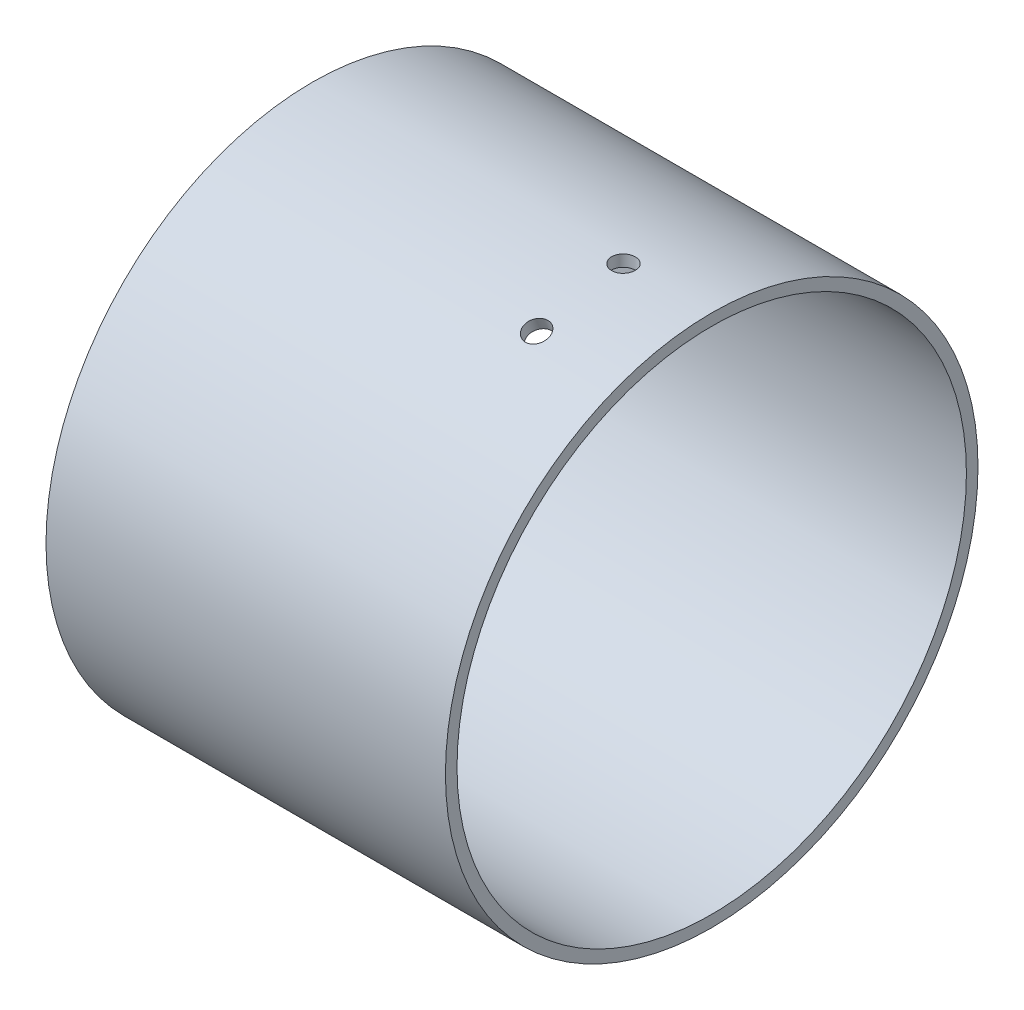
ISO-10303-21;
HEADER;
FILE_DESCRIPTION(('STEP AP214'),'2;1');
FILE_NAME('part.step','',(''),(''),'','','');
FILE_SCHEMA(('AUTOMOTIVE_DESIGN { 1 0 10303 214 1 1 1 1 }'));
ENDSEC;
DATA;
#1=APPLICATION_CONTEXT('core data for automotive mechanical design processes');
#2=APPLICATION_PROTOCOL_DEFINITION('international standard','automotive_design',2000,#1);
#3=PRODUCT_CONTEXT('',#1,'mechanical');
#4=PRODUCT('Part','Part','',(#3));
#5=PRODUCT_RELATED_PRODUCT_CATEGORY('part','',(#4));
#6=PRODUCT_DEFINITION_FORMATION('','',#4);
#7=PRODUCT_DEFINITION_CONTEXT('part definition',#1,'design');
#8=PRODUCT_DEFINITION('design','',#6,#7);
#9=PRODUCT_DEFINITION_SHAPE('','',#8);
#10=(LENGTH_UNIT() NAMED_UNIT(*) SI_UNIT(.MILLI.,.METRE.));
#11=(NAMED_UNIT(*) PLANE_ANGLE_UNIT() SI_UNIT($,.RADIAN.));
#12=(NAMED_UNIT(*) SI_UNIT($,.STERADIAN.) SOLID_ANGLE_UNIT());
#13=UNCERTAINTY_MEASURE_WITH_UNIT(LENGTH_MEASURE(1.E-05),#10,'distance_accuracy_value','');
#14=(GEOMETRIC_REPRESENTATION_CONTEXT(3) GLOBAL_UNCERTAINTY_ASSIGNED_CONTEXT((#13)) GLOBAL_UNIT_ASSIGNED_CONTEXT((#10,
#11,#12)) REPRESENTATION_CONTEXT('',''));
#15=CARTESIAN_POINT('',(0.,0.,0.));
#16=DIRECTION('',(0.,0.,1.));
#17=DIRECTION('',(1.,0.,0.));
#18=AXIS2_PLACEMENT_3D('',#15,#16,#17);
#19=CARTESIAN_POINT('',(69.,0.,0.));
#20=DIRECTION('',(1.,0.,0.));
#21=DIRECTION('',(0.,0.,-1.));
#22=AXIS2_PLACEMENT_3D('',#19,#20,#21);
#23=PLANE('',#22);
#24=CARTESIAN_POINT('',(69.,0.,0.));
#25=DIRECTION('',(1.,0.,0.));
#26=DIRECTION('',(0.,0.,-1.));
#27=AXIS2_PLACEMENT_3D('',#24,#25,#26);
#28=CIRCLE('',#27,46.);
#29=CARTESIAN_POINT('',(69.,0.,-46.));
#30=VERTEX_POINT('',#29);
#31=EDGE_CURVE('E10',#30,#30,#28,.T.);
#32=ORIENTED_EDGE('',*,*,#31,.T.);
#33=EDGE_LOOP('',(#32));
#34=FACE_BOUND('',#33,.T.);
#35=CARTESIAN_POINT('',(69.,0.,0.));
#36=DIRECTION('',(1.,0.,0.));
#37=DIRECTION('',(0.,0.,-1.));
#38=AXIS2_PLACEMENT_3D('',#35,#36,#37);
#39=CIRCLE('',#38,44.);
#40=CARTESIAN_POINT('',(69.,0.,-44.));
#41=VERTEX_POINT('',#40);
#42=EDGE_CURVE('E43',#41,#41,#39,.T.);
#43=ORIENTED_EDGE('',*,*,#42,.F.);
#44=EDGE_LOOP('',(#43));
#45=FACE_BOUND('',#44,.T.);
#46=ADVANCED_FACE('F31',(#34,#45),#23,.T.);
#47=CARTESIAN_POINT('',(0.,0.,0.));
#48=DIRECTION('',(1.,0.,0.));
#49=DIRECTION('',(0.,0.,-1.));
#50=AXIS2_PLACEMENT_3D('',#47,#48,#49);
#51=PLANE('',#50);
#52=CARTESIAN_POINT('',(0.,0.,0.));
#53=DIRECTION('',(1.,0.,0.));
#54=DIRECTION('',(0.,0.,-1.));
#55=AXIS2_PLACEMENT_3D('',#52,#53,#54);
#56=CIRCLE('',#55,46.);
#57=CARTESIAN_POINT('',(0.,0.,-46.));
#58=VERTEX_POINT('',#57);
#59=EDGE_CURVE('E36',#58,#58,#56,.T.);
#60=ORIENTED_EDGE('',*,*,#59,.F.);
#61=EDGE_LOOP('',(#60));
#62=FACE_BOUND('',#61,.T.);
#63=CARTESIAN_POINT('',(0.,0.,0.));
#64=DIRECTION('',(1.,0.,0.));
#65=DIRECTION('',(0.,0.,-1.));
#66=AXIS2_PLACEMENT_3D('',#63,#64,#65);
#67=CIRCLE('',#66,44.);
#68=CARTESIAN_POINT('',(0.,0.,-44.));
#69=VERTEX_POINT('',#68);
#70=EDGE_CURVE('E45',#69,#69,#67,.T.);
#71=ORIENTED_EDGE('',*,*,#70,.T.);
#72=EDGE_LOOP('',(#71));
#73=FACE_BOUND('',#72,.T.);
#74=ADVANCED_FACE('F77',(#62,#73),#51,.F.);
#75=CARTESIAN_POINT('',(69.,0.,0.));
#76=DIRECTION('',(-1.,0.,0.));
#77=DIRECTION('',(0.,0.,1.));
#78=AXIS2_PLACEMENT_3D('',#75,#76,#77);
#79=CYLINDRICAL_SURFACE('',#78,46.);
#80=CARTESIAN_POINT('',(54.,45.9434053143207,2.28111992758998));
#81=CARTESIAN_POINT('',(53.8852091887696,45.9434059520648,2.28111485929366));
#82=CARTESIAN_POINT('',(53.7703365874878,45.943889942447,2.27142318395973));
#83=CARTESIAN_POINT('',(53.5437592134882,45.9457780972293,2.23289781368698));
#84=CARTESIAN_POINT('',(53.4320583535027,45.9471833507011,2.20404146268955));
#85=CARTESIAN_POINT('',(53.2151395212184,45.9507671369807,2.1280130350752));
#86=CARTESIAN_POINT('',(53.1099183185955,45.9529452807542,2.08085017192561));
#87=CARTESIAN_POINT('',(52.9089169142848,45.9578493700051,1.96956050785337));
#88=CARTESIAN_POINT('',(52.8131344666421,45.9605751846927,1.90543775598548));
#89=CARTESIAN_POINT('',(52.633621145223,45.9662978774121,1.76198763577333));
#90=CARTESIAN_POINT('',(52.5498990226666,45.969294949732,1.68264932305556));
#91=CARTESIAN_POINT('',(52.3969573398346,45.9752554360335,1.51104045068999));
#92=CARTESIAN_POINT('',(52.3277383667706,45.9782188486476,1.41876936766533));
#93=CARTESIAN_POINT('',(52.2057457169492,45.9838192877889,1.22386980229755));
#94=CARTESIAN_POINT('',(52.1529785604573,45.9864561846607,1.12123723471799));
#95=CARTESIAN_POINT('',(52.0654293442119,45.9911494570148,0.908555963408038));
#96=CARTESIAN_POINT('',(52.0306471693399,45.9932058362128,0.798507307151797));
#97=CARTESIAN_POINT('',(51.9800775584406,45.9965527713279,0.574194896922338));
#98=CARTESIAN_POINT('',(51.9642774645714,45.9978438372882,0.459934004259349));
#99=CARTESIAN_POINT('',(51.952081472976,45.9995663056323,0.23037534331828));
#100=CARTESIAN_POINT('',(51.9556854471969,45.9999977136893,0.115077581887805));
#101=CARTESIAN_POINT('',(51.9821847480803,46.0000022670781,-0.113196156602176));
#102=CARTESIAN_POINT('',(52.0050664436614,45.9995760185546,-0.226173716445867));
#103=CARTESIAN_POINT('',(52.0694505402093,45.9979634007833,-0.446686439155511));
#104=CARTESIAN_POINT('',(52.1109530071589,45.996777028842,-0.554221582734702));
#105=CARTESIAN_POINT('',(52.2114161213941,45.9938236472781,-0.760840110468499));
#106=CARTESIAN_POINT('',(52.2703829914636,45.9920564306686,-0.859920465840257));
#107=CARTESIAN_POINT('',(52.4040964993486,45.9881832015296,-1.04678276490501));
#108=CARTESIAN_POINT('',(52.478843223919,45.9860771871375,-1.13456464647669));
#109=CARTESIAN_POINT('',(52.6420717444146,45.9817994346659,-1.29641657706345));
#110=CARTESIAN_POINT('',(52.7305653655903,45.9796276413097,-1.37047469931516));
#111=CARTESIAN_POINT('',(52.9187340793171,45.9754970646412,-1.50268389816145));
#112=CARTESIAN_POINT('',(53.0184091744044,45.9735382813773,-1.56083497114775));
#113=CARTESIAN_POINT('',(53.2261184714863,45.9700800124716,-1.65957727507637));
#114=CARTESIAN_POINT('',(53.3341528773368,45.9685805380353,-1.70016807762237));
#115=CARTESIAN_POINT('',(53.555510918732,45.9662280841509,-1.76262900294206));
#116=CARTESIAN_POINT('',(53.6688345228204,45.9653751008585,-1.78449923703674));
#117=CARTESIAN_POINT('',(53.8974502680274,45.9644220465223,-1.80888307436124));
#118=CARTESIAN_POINT('',(54.0127406416385,45.964321331818,-1.81141322551292));
#119=CARTESIAN_POINT('',(54.2421085230635,45.9648835899868,-1.79708818999605));
#120=CARTESIAN_POINT('',(54.3561860340326,45.9655465608727,-1.78023305376959));
#121=CARTESIAN_POINT('',(54.5798435813833,45.9675535565866,-1.72762994229583));
#122=CARTESIAN_POINT('',(54.6894253977242,45.9688973090073,-1.69188952354182));
#123=CARTESIAN_POINT('',(54.9010357104069,45.9720986759716,-1.602538698015));
#124=CARTESIAN_POINT('',(55.0030641723412,45.9739562928557,-1.54892820984505));
#125=CARTESIAN_POINT('',(55.196747712728,45.9779543059823,-1.42531744331151));
#126=CARTESIAN_POINT('',(55.2883956874016,45.9800948937278,-1.35530604048875));
#127=CARTESIAN_POINT('',(55.4586452810879,45.9843864020971,-1.20089817678065));
#128=CARTESIAN_POINT('',(55.5372468331449,45.9865373227739,-1.11650164207379));
#129=CARTESIAN_POINT('',(55.6792278509785,45.9905722009934,-0.935649335577869));
#130=CARTESIAN_POINT('',(55.7425966367788,45.9924559708543,-0.839185174579908));
#131=CARTESIAN_POINT('',(55.8522403169389,45.9957005388652,-0.636979432755378));
#132=CARTESIAN_POINT('',(55.8985152740052,45.9970613389336,-0.531237885963498));
#133=CARTESIAN_POINT('',(55.9726390161939,45.9990602347191,-0.313519721074557));
#134=CARTESIAN_POINT('',(56.0004946614284,45.9996985995641,-0.201545441169629));
#135=CARTESIAN_POINT('',(56.0370115335636,46.0001329501857,0.0254919883610458));
#136=CARTESIAN_POINT('',(56.0456728387694,45.9999289393989,0.140555125383565));
#137=CARTESIAN_POINT('',(56.043554379975,45.9986521757424,0.370397719483432));
#138=CARTESIAN_POINT('',(56.0327913862475,45.9975801727079,0.485177335677087));
#139=CARTESIAN_POINT('',(55.9921644732912,45.9946393663857,0.711294256872851));
#140=CARTESIAN_POINT('',(55.9623005173775,45.9927705615676,0.822631555263288));
#141=CARTESIAN_POINT('',(55.8843226363764,45.9883982452635,1.03870799717364));
#142=CARTESIAN_POINT('',(55.8362085060822,45.9858947266409,1.14344706648696));
#143=CARTESIAN_POINT('',(55.7230994038996,45.9804893388021,1.34335850162151));
#144=CARTESIAN_POINT('',(55.6581049803395,45.9775874825266,1.43853117805188));
#145=CARTESIAN_POINT('',(55.5130217706352,45.971668148861,1.61669203172198));
#146=CARTESIAN_POINT('',(55.4329216242711,45.9686505858235,1.6996709545718));
#147=CARTESIAN_POINT('',(55.2599019734872,45.962805006431,1.85102935651136));
#148=CARTESIAN_POINT('',(55.1669793133893,45.9599770369913,1.9194052311395));
#149=CARTESIAN_POINT('',(54.9708913989624,45.9547983652499,2.03964298517857));
#150=CARTESIAN_POINT('',(54.8677174372294,45.9524480739355,2.09149066559217));
#151=CARTESIAN_POINT('',(54.6541958594725,45.9484735357265,2.17706967270035));
#152=CARTESIAN_POINT('',(54.5438569182605,45.9468484289386,2.21082246517511));
#153=CARTESIAN_POINT('',(54.3606905230218,45.9449240821097,2.25037077027));
#154=CARTESIAN_POINT('',(54.2890503221836,45.9443568586466,2.26188706070603));
#155=CARTESIAN_POINT('',(54.1449509533619,45.9435972735056,2.2772632371562));
#156=CARTESIAN_POINT('',(54.0724917859251,45.9434049115776,2.28112312828042));
#157=CARTESIAN_POINT('',(54.,45.9434053143207,2.28111992758998));
#158=B_SPLINE_CURVE_WITH_KNOTS('',3,(#80,#81,#82,#83,#84,#85,#86,#87,#88,#89,#90,#91,#92,#93,
#94,#95,#96,#97,#98,#99,#100,#101,#102,#103,#104,#105,#106,#107,#108,#109,#110,#111,#112,#113,
#114,#115,#116,#117,#118,#119,#120,#121,#122,#123,#124,#125,#126,#127,#128,#129,#130,#131,#132,
#133,#134,#135,#136,#137,#138,#139,#140,#141,#142,#143,#144,#145,#146,#147,#148,#149,#150,#151,
#152,#153,#154,#155,#156,#157),.UNSPECIFIED.,.T.,.F.,(4,2,2,2,2,2,2,2,2,2,2,2,2,2,2,2,2,2,2,2,2,
2,2,2,2,2,2,2,2,2,2,2,2,2,2,2,2,2,4),(0.,0.344107816898277,0.688623156328655,1.03296532931029,
1.37722536709815,1.72173396214997,2.06625650316298,2.41091541399544,2.75557211870121,
3.09999886780337,3.4444233439384,3.78860448521623,4.13278684611308,4.47709199130739,
4.82139902948113,5.16600390187606,5.51060885243955,5.85522220943235,6.19983351718367,
6.54414993271413,6.88846545230764,7.23264330650477,7.57682272843369,7.92123628077925,
8.26565160063745,8.61030769675449,8.95496252853128,9.29948892421056,9.64401391435864,
9.98824159574565,10.3324699382508,10.6767021514085,11.0209231841524,11.3654041272922,
11.7099700004368,12.0548310895635,12.3992821631242,12.6165905572309,12.8338988063004),.UNSPECIFIED.);
#159=CARTESIAN_POINT('',(54.,45.9434053143207,2.28111992758998));
#160=VERTEX_POINT('',#159);
#161=EDGE_CURVE('E94',#160,#160,#158,.T.);
#162=ORIENTED_EDGE('',*,*,#161,.T.);
#163=EDGE_LOOP('',(#162));
#164=FACE_BOUND('',#163,.T.);
#165=CARTESIAN_POINT('',(54.,42.6766684131246,17.1668859481333));
#166=CARTESIAN_POINT('',(53.8852091887696,42.6766706718183,17.1668813663599));
#167=CARTESIAN_POINT('',(53.7703365874878,42.6802946334221,17.1578797154134));
#168=CARTESIAN_POINT('',(53.5437592134882,42.6946664473815,17.1220855783705));
#169=CARTESIAN_POINT('',(53.4320583535027,42.7054227313881,17.0952720354383));
#170=CARTESIAN_POINT('',(53.2151395212184,42.7336503845806,17.024587065856));
#171=CARTESIAN_POINT('',(53.1099183185955,42.7511183757931,16.9807242199181));
#172=CARTESIAN_POINT('',(52.9089169142848,42.7921146745085,16.8771445746574));
#173=CARTESIAN_POINT('',(52.8131344666421,42.8156415354634,16.8174315594394));
#174=CARTESIAN_POINT('',(52.633621145223,42.8679192050683,16.6837239251715));
#175=CARTESIAN_POINT('',(52.5498990226666,42.8966737731673,16.6097190258686));
#176=CARTESIAN_POINT('',(52.3969573398346,42.9583764141225,16.4494757215757));
#177=CARTESIAN_POINT('',(52.3277383667706,42.9913246566878,16.3632368214858));
#178=CARTESIAN_POINT('',(52.2057457169492,43.06029671154,16.1808634101875));
#179=CARTESIAN_POINT('',(52.1529785604573,43.0963217360447,16.0847249955837));
#180=CARTESIAN_POINT('',(52.0654293442119,43.1702461762814,15.8852493652248));
#181=CARTESIAN_POINT('',(52.0306471693399,43.2081455800141,15.7819121955523));
#182=CARTESIAN_POINT('',(51.9800775584406,43.2845977803308,15.5710038732311));
#183=CARTESIAN_POINT('',(51.9642774645714,43.3231501240987,15.4634355915052));
#184=CARTESIAN_POINT('',(51.952081472976,43.3997811028907,15.2470381820946));
#185=CARTESIAN_POINT('',(51.9556854471969,43.4378597410392,15.1382090627352));
#186=CARTESIAN_POINT('',(51.9821847480803,43.5124472672362,14.9224647681623));
#187=CARTESIAN_POINT('',(52.0050664436614,43.5489572453019,14.8155482950738));
#188=CARTESIAN_POINT('',(52.0694505402093,43.6194806183838,14.6066107080722));
#189=CARTESIAN_POINT('',(52.1109530071589,43.6534940045529,14.5045896115074));
#190=CARTESIAN_POINT('',(52.2114161213941,43.7182105862787,14.3083456242995));
#191=CARTESIAN_POINT('',(52.2703829914636,43.7489125966227,14.2141255285875));
#192=CARTESIAN_POINT('',(52.4040964993486,43.8063049173611,14.0362529836684));
#193=CARTESIAN_POINT('',(52.478843223919,43.8329952056982,13.9526005925647));
#194=CARTESIAN_POINT('',(52.6420717444146,43.8818336380311,13.7982336462059));
#195=CARTESIAN_POINT('',(52.7305653655903,43.9039778329865,13.7275303450976));
#196=CARTESIAN_POINT('',(52.9187340793171,43.9432702793528,13.6012273855846));
#197=CARTESIAN_POINT('',(53.0184091744044,43.9604185296303,13.5456277306059));
#198=CARTESIAN_POINT('',(53.2261184714863,43.9894118442252,13.4511746209813));
#199=CARTESIAN_POINT('',(53.3341528773368,44.0012567791644,13.4123215748819));
#200=CARTESIAN_POINT('',(53.555510918732,44.019441109641,13.3525199749352));
#201=CARTESIAN_POINT('',(53.6688345228204,44.0257805379166,13.3315713146203));
#202=CARTESIAN_POINT('',(53.8974502680274,44.0328466495373,13.3082143049272));
#203=CARTESIAN_POINT('',(54.0127406416385,44.0335781312016,13.3057901054972));
#204=CARTESIAN_POINT('',(54.2421085230635,44.0294291542234,13.3195126696468));
#205=CARTESIAN_POINT('',(54.3561860340326,44.0245487101835,13.3356593849036));
#206=CARTESIAN_POINT('',(54.5798435813833,44.0092586959194,13.3860313099444));
#207=CARTESIAN_POINT('',(54.6894253977242,43.9988513371494,13.4202492889425));
#208=CARTESIAN_POINT('',(54.9010357104069,43.9726836704766,13.505742399739));
#209=CARTESIAN_POINT('',(55.0030641723412,43.9569233381913,13.5570176092322));
#210=CARTESIAN_POINT('',(55.196747712728,43.9203149446255,13.6751507173454));
#211=CARTESIAN_POINT('',(55.2883956874017,43.8994634296753,13.7420191924693));
#212=CARTESIAN_POINT('',(55.4586452810879,43.8530701768819,13.8893551063336));
#213=CARTESIAN_POINT('',(55.5372468331449,43.8275284149693,13.9698226148614));
#214=CARTESIAN_POINT('',(55.6792278509785,43.7722524994062,14.142067818469));
#215=CARTESIAN_POINT('',(55.7425966367788,43.7425154273923,14.2338533810263));
#216=CARTESIAN_POINT('',(55.8522403169389,43.6795158282883,14.4260219001993));
#217=CARTESIAN_POINT('',(55.8985152740052,43.6462533141315,14.5264048252749));
#218=CARTESIAN_POINT('',(55.9726390161939,43.5770080774774,14.732827430887));
#219=CARTESIAN_POINT('',(56.0004946614284,43.5410263732886,14.8388649894857));
#220=CARTESIAN_POINT('',(56.0370115335636,43.4672575991598,15.0535842271704));
#221=CARTESIAN_POINT('',(56.0456728387694,43.4294705365856,15.1622658954676));
#222=CARTESIAN_POINT('',(56.043554379975,43.35316803297,15.3790772792323));
#223=CARTESIAN_POINT('',(56.0327913862475,43.3146532486242,15.4872073900751));
#224=CARTESIAN_POINT('',(55.9921644732912,43.2379953055468,15.6999538827748));
#225=CARTESIAN_POINT('',(55.9623005173775,43.1998521475289,15.8045702578829));
#226=CARTESIAN_POINT('',(55.8843226363764,43.1251217545263,16.0073595925634));
#227=CARTESIAN_POINT('',(55.8362085060822,43.0885345370419,16.1055324796701));
#228=CARTESIAN_POINT('',(55.7230994038996,43.0181093150171,16.2927064314316));
#229=CARTESIAN_POINT('',(55.6581049803395,42.9842712212229,16.381707793877));
#230=CARTESIAN_POINT('',(55.5130217706352,42.9204667643674,16.5481569440006));
#231=CARTESIAN_POINT('',(55.4329216242711,42.8905033440193,16.6255959571984));
#232=CARTESIAN_POINT('',(55.2599019734872,42.8355256817531,16.7667377061172));
#233=CARTESIAN_POINT('',(55.1669793133893,42.8105126618508,16.8304370505226));
#234=CARTESIAN_POINT('',(54.9708913989624,42.7663332663596,16.9423839895223));
#235=CARTESIAN_POINT('',(54.8677174372295,42.7471719184002,16.9906182986592));
#236=CARTESIAN_POINT('',(54.6541958594725,42.7154545248491,17.0702020304008));
#237=CARTESIAN_POINT('',(54.5438569182605,42.7028906531034,17.1015714597656));
#238=CARTESIAN_POINT('',(54.3606905230218,42.6881504128081,17.1383205667294));
#239=CARTESIAN_POINT('',(54.2890503221836,42.683851634812,17.1490195010504));
#240=CARTESIAN_POINT('',(54.1449509533619,42.6781099227271,17.1633036361011));
#241=CARTESIAN_POINT('',(54.0724917859251,42.6766669867321,17.1668888415787));
#242=CARTESIAN_POINT('',(54.,42.6766684131246,17.1668859481333));
#243=B_SPLINE_CURVE_WITH_KNOTS('',3,(#165,#166,#167,#168,#169,#170,#171,#172,#173,#174,#175,
#176,#177,#178,#179,#180,#181,#182,#183,#184,#185,#186,#187,#188,#189,#190,#191,#192,#193,#194,
#195,#196,#197,#198,#199,#200,#201,#202,#203,#204,#205,#206,#207,#208,#209,#210,#211,#212,#213,
#214,#215,#216,#217,#218,#219,#220,#221,#222,#223,#224,#225,#226,#227,#228,#229,#230,#231,#232,
#233,#234,#235,#236,#237,#238,#239,#240,#241,#242),.UNSPECIFIED.,.T.,.F.,(4,2,2,2,2,2,2,2,2,2,2,
2,2,2,2,2,2,2,2,2,2,2,2,2,2,2,2,2,2,2,2,2,2,2,2,2,2,2,4),(0.,0.344107816898277,
0.688623156328655,1.03296532931028,1.37722536709815,1.72173396214997,2.06625650316298,
2.41091541399544,2.75557211870121,3.09999886780338,3.4444233439384,3.78860448521623,
4.13278684611308,4.47709199130738,4.82139902948113,5.16600390187605,5.51060885243956,
5.85522220943235,6.19983351718367,6.54414993271413,6.88846545230764,7.23264330650478,
7.57682272843369,7.92123628077926,8.26565160063745,8.61030769675449,8.95496252853128,
9.29948892421055,9.64401391435864,9.98824159574564,10.3324699382508,10.6767021514085,
11.0209231841524,11.3654041272922,11.7099700004368,12.0548310895635,12.3992821631242,
12.6165905572309,12.8338988063004),.UNSPECIFIED.);
#244=CARTESIAN_POINT('',(54.,42.6766684131246,17.1668859481333));
#245=VERTEX_POINT('',#244);
#246=EDGE_CURVE('E48',#245,#245,#243,.T.);
#247=ORIENTED_EDGE('',*,*,#246,.T.);
#248=EDGE_LOOP('',(#247));
#249=FACE_BOUND('',#248,.T.);
#250=ORIENTED_EDGE('',*,*,#31,.F.);
#251=EDGE_LOOP('',(#250));
#252=FACE_BOUND('',#251,.T.);
#253=ORIENTED_EDGE('',*,*,#59,.T.);
#254=EDGE_LOOP('',(#253));
#255=FACE_BOUND('',#254,.T.);
#256=ADVANCED_FACE('F33',(#164,#249,#252,#255),#79,.T.);
#257=CARTESIAN_POINT('',(69.,0.,0.));
#258=DIRECTION('',(-1.,0.,0.));
#259=DIRECTION('',(0.,0.,1.));
#260=AXIS2_PLACEMENT_3D('',#257,#258,#259);
#261=CYLINDRICAL_SURFACE('',#260,44.);
#262=CARTESIAN_POINT('',(54.,43.9413629959439,2.27081880798313));
#263=CARTESIAN_POINT('',(53.8852148512622,43.9413636611787,2.27081374193793));
#264=CARTESIAN_POINT('',(53.7703480508876,43.9418673766566,2.26112312058856));
#265=CARTESIAN_POINT('',(53.5437825075651,43.9438323007857,2.22260214957332));
#266=CARTESIAN_POINT('',(53.4320876711831,43.94529464089,2.19374918229028));
#267=CARTESIAN_POINT('',(53.2151809171494,43.9490234099599,2.11773019074366));
#268=CARTESIAN_POINT('',(53.1099657541381,43.9512894324915,2.07057342184716));
#269=CARTESIAN_POINT('',(52.9089752332171,43.956390162186,1.95929857219899));
#270=CARTESIAN_POINT('',(52.8131976383135,43.9592247340994,1.89518452418248));
#271=CARTESIAN_POINT('',(52.6336866876528,43.9651738710912,1.75174979037625));
#272=CARTESIAN_POINT('',(52.5499627776589,43.9682886526813,1.6724172911063));
#273=CARTESIAN_POINT('',(52.397016219423,43.9744800490094,1.50081971428496));
#274=CARTESIAN_POINT('',(52.3277941600056,43.9775566621929,1.40855411185935));
#275=CARTESIAN_POINT('',(52.2057915820806,43.9833664250377,1.21366053067192));
#276=CARTESIAN_POINT('',(52.1530182195814,43.9860994249023,1.11102806744325));
#277=CARTESIAN_POINT('',(52.0654570640915,43.9909567931574,0.89834477180164));
#278=CARTESIAN_POINT('',(52.0306691486253,43.9930811656925,0.788293989911027));
#279=CARTESIAN_POINT('',(51.9800907871068,43.9965281562841,0.563982380700875));
#280=CARTESIAN_POINT('',(51.9642865044304,43.9978513579418,0.449724682363989));
#281=CARTESIAN_POINT('',(51.952081342509,43.999598828935,0.220171285839748));
#282=CARTESIAN_POINT('',(51.955680326577,44.0000231046031,0.104875594970275));
#283=CARTESIAN_POINT('',(51.9821680291922,43.9999749483636,-0.123387200430125));
#284=CARTESIAN_POINT('',(52.0050418500616,43.9995032086405,-0.236356034345283));
#285=CARTESIAN_POINT('',(52.0694068361831,43.9977664167034,-0.456852798670587));
#286=CARTESIAN_POINT('',(52.1108980716506,43.9965013614974,-0.564380708558617));
#287=CARTESIAN_POINT('',(52.2113371147241,43.9933661445264,-0.770990507167135));
#288=CARTESIAN_POINT('',(52.2702917186927,43.9914957471491,-0.87006908822284));
#289=CARTESIAN_POINT('',(52.4039790202364,43.9874032709628,-1.05693054011351));
#290=CARTESIAN_POINT('',(52.4787118132066,43.9851811900276,-1.14471334264882));
#291=CARTESIAN_POINT('',(52.6419183437385,43.9806711336658,-1.30657713424417));
#292=CARTESIAN_POINT('',(52.7304050056722,43.9783830979265,-1.38064509066403));
#293=CARTESIAN_POINT('',(52.9185620248287,43.9740332463921,-1.51287511988452));
#294=CARTESIAN_POINT('',(53.0182323847335,43.9719714306512,-1.57103718887066));
#295=CARTESIAN_POINT('',(53.2259352821312,43.9683319572205,-1.66980221624599));
#296=CARTESIAN_POINT('',(53.3339680461409,43.9667543126515,-1.71040469879292));
#297=CARTESIAN_POINT('',(53.5553255986529,43.9642792757886,-1.77288858311931));
#298=CARTESIAN_POINT('',(53.6686503527637,43.9633818790746,-1.79477010654462));
#299=CARTESIAN_POINT('',(53.8972615140201,43.9623788801137,-1.81917440215172));
#300=CARTESIAN_POINT('',(54.0125459874017,43.9622725381246,-1.82171526049979));
#301=CARTESIAN_POINT('',(54.2419038372879,43.9628628123654,-1.80741323254216));
#302=CARTESIAN_POINT('',(54.3559772172419,43.9635594263078,-1.79057040146028));
#303=CARTESIAN_POINT('',(54.5796240389856,43.9656691054545,-1.73799443649329));
#304=CARTESIAN_POINT('',(54.6891994271824,43.9670818571566,-1.7022695682716));
#305=CARTESIAN_POINT('',(54.9007997453125,43.9704488190279,-1.6129526855156));
#306=CARTESIAN_POINT('',(55.0028246375868,43.9724030318976,-1.5593605818737));
#307=CARTESIAN_POINT('',(55.1965110663023,43.9766111912686,-1.43578501623209));
#308=CARTESIAN_POINT('',(55.2881648429213,43.9788653594929,-1.36578939956865));
#309=CARTESIAN_POINT('',(55.4584292942373,43.983388077206,-1.2114126391574));
#310=CARTESIAN_POINT('',(55.5370398962333,43.985656626775,-1.1270314152313));
#311=CARTESIAN_POINT('',(55.6790472125464,43.9899178364563,-0.946202253544553));
#312=CARTESIAN_POINT('',(55.7424322517051,43.991910284358,-0.849745141502594));
#313=CARTESIAN_POINT('',(55.8521093691657,43.9953507699633,-0.647549807168901));
#314=CARTESIAN_POINT('',(55.8984015142753,43.9967988097946,-0.541811621154351));
#315=CARTESIAN_POINT('',(55.9725583432642,43.9989408423797,-0.32410008144432));
#316=CARTESIAN_POINT('',(56.0004305158324,43.9996351416425,-0.212129281733366));
#317=CARTESIAN_POINT('',(56.0369807404078,44.0001438485796,0.0149043526346919));
#318=CARTESIAN_POINT('',(56.0456588812275,43.9999582603252,0.129967172982264));
#319=CARTESIAN_POINT('',(56.0435738298249,43.9986788069861,0.359802473199536));
#320=CARTESIAN_POINT('',(56.0328289634991,43.9975857985917,0.474575124542455));
#321=CARTESIAN_POINT('',(55.9922407563134,43.9945659729146,0.700680856418829));
#322=CARTESIAN_POINT('',(55.9623973790088,43.9926391540406,0.812013930388309));
#323=CARTESIAN_POINT('',(55.8844629071399,43.988120311217,1.0280849573594));
#324=CARTESIAN_POINT('',(55.8363716306363,43.985528280635,1.13282284459207));
#325=CARTESIAN_POINT('',(55.7233099590518,43.9799252761796,1.33273602715171));
#326=CARTESIAN_POINT('',(55.6583401016721,43.9769143156536,1.42791162697077));
#327=CARTESIAN_POINT('',(55.5133009366682,43.9707680359279,1.60609051814773));
#328=CARTESIAN_POINT('',(55.4332190701597,43.9676326150188,1.68908358244289));
#329=CARTESIAN_POINT('',(55.260233302613,43.9615560900914,1.84047356695886));
#330=CARTESIAN_POINT('',(55.1673262475181,43.9586150341365,1.90886688614415));
#331=CARTESIAN_POINT('',(54.9712621900252,43.9532275373818,2.02914475747194));
#332=CARTESIAN_POINT('',(54.8680961108152,43.9507815405045,2.08101451654253));
#333=CARTESIAN_POINT('',(54.6545852184765,43.9466441519669,2.16663856526549));
#334=CARTESIAN_POINT('',(54.5442490765063,43.9449518675683,2.20041429615159));
#335=CARTESIAN_POINT('',(54.3610207754768,43.9429466379011,2.24001321378352));
#336=CARTESIAN_POINT('',(54.2893159776504,43.9423551972181,2.25155061702449));
#337=CARTESIAN_POINT('',(54.1450849950643,43.9415631661263,2.26695501250468));
#338=CARTESIAN_POINT('',(54.0725588109068,43.9413625754309,2.27082201036794));
#339=CARTESIAN_POINT('',(54.,43.9413629959439,2.27081880798313));
#340=B_SPLINE_CURVE_WITH_KNOTS('',3,(#262,#263,#264,#265,#266,#267,#268,#269,#270,#271,#272,
#273,#274,#275,#276,#277,#278,#279,#280,#281,#282,#283,#284,#285,#286,#287,#288,#289,#290,#291,
#292,#293,#294,#295,#296,#297,#298,#299,#300,#301,#302,#303,#304,#305,#306,#307,#308,#309,#310,
#311,#312,#313,#314,#315,#316,#317,#318,#319,#320,#321,#322,#323,#324,#325,#326,#327,#328,#329,
#330,#331,#332,#333,#334,#335,#336,#337,#338,#339),.UNSPECIFIED.,.T.,.F.,(4,2,2,2,2,2,2,2,2,2,2,
2,2,2,2,2,2,2,2,2,2,2,2,2,2,2,2,2,2,2,2,2,2,2,2,2,2,2,4),(0.,0.344090582607348,
0.688588024229604,1.03291149623871,1.37715315566715,1.72166312556182,2.06618708102373,
2.41086071315188,2.75553199812348,3.0999519093683,3.44436939433966,3.78852092015212,
4.13267374394091,4.47696068087717,4.82124969943836,5.1658642209313,5.5104788250687,
5.85510276723437,6.19972447007072,6.54402386485712,6.88832227874275,7.23247009973276,
7.57661963708467,7.9210249929491,8.26543226842211,8.61010280275323,8.95477198992134,
9.29930096456814,9.64382834504728,9.98803082846617,10.332233968709,10.6764405408929,
11.0206361490243,11.3651190719041,11.7096868637701,12.0545622760007,12.399028105393,
12.6165372701128,12.8340462753522),.UNSPECIFIED.);
#341=CARTESIAN_POINT('',(54.,43.9413629959439,2.27081880798313));
#342=VERTEX_POINT('',#341);
#343=EDGE_CURVE('E99',#342,#342,#340,.T.);
#344=ORIENTED_EDGE('',*,*,#343,.F.);
#345=EDGE_LOOP('',(#344));
#346=FACE_BOUND('',#345,.T.);
#347=CARTESIAN_POINT('',(54.,40.7878664059062,16.5030286327678));
#348=CARTESIAN_POINT('',(53.8852148512622,40.7878686898464,16.5030240621039));
#349=CARTESIAN_POINT('',(53.7703480508876,40.7915109496419,16.4940298520217));
#350=CARTESIAN_POINT('',(53.5437825075651,40.8059538823908,16.4582649554275));
#351=CARTESIAN_POINT('',(53.4320876711831,40.816763014491,16.4314732622585));
#352=CARTESIAN_POINT('',(53.2151809171494,40.8451246106126,16.3608445806909));
#353=CARTESIAN_POINT('',(53.1099657541381,40.8626736665262,16.3170162069199));
#354=CARTESIAN_POINT('',(52.9089752332171,40.9038509735306,16.2135148108158));
#355=CARTESIAN_POINT('',(52.8131976383135,40.9274777791905,16.1538455557064));
#356=CARTESIAN_POINT('',(52.6336866876528,40.9799644383589,16.0202264489052));
#357=CARTESIAN_POINT('',(52.5499627776589,41.0088283562809,15.9462655028123));
#358=CARTESIAN_POINT('',(52.397016219423,41.0707455440631,15.7861083187193));
#359=CARTESIAN_POINT('',(52.3277941600056,41.1037989839446,15.6999115841428));
#360=CARTESIAN_POINT('',(52.2057915820806,41.1729669193523,15.5176122203376));
#361=CARTESIAN_POINT('',(52.1530182195814,41.2090827384998,15.4215053038125));
#362=CARTESIAN_POINT('',(52.0654570640915,41.2831629302476,15.2220813748021));
#363=CARTESIAN_POINT('',(52.0306691486253,41.321127290258,15.1187644114205));
#364=CARTESIAN_POINT('',(51.9800907871068,41.3976737931634,14.907889536996));
#365=CARTESIAN_POINT('',(51.9642865044304,41.4362554653073,14.8003347738915));
#366=CARTESIAN_POINT('',(51.952081342509,41.512908354543,14.5839505090235));
#367=CARTESIAN_POINT('',(51.955680326577,41.5509795752289,14.4751210162451));
#368=CARTESIAN_POINT('',(51.9821680291922,41.6255137091655,14.2593698425256));
#369=CARTESIAN_POINT('',(52.0050418500616,41.6619778416495,14.1524467532665));
#370=CARTESIAN_POINT('',(52.0694068361831,41.7323786413663,13.9434836777642));
#371=CARTESIAN_POINT('',(52.1108980716506,41.7663152990663,13.8414437099392));
#372=CARTESIAN_POINT('',(52.2113371147241,41.8308571727039,13.6451485622308));
#373=CARTESIAN_POINT('',(52.2702917186927,41.8614610852561,13.5508964315024));
#374=CARTESIAN_POINT('',(52.4039790202364,41.9186459147122,13.3729530533055));
#375=CARTESIAN_POINT('',(52.4787118132066,41.9452268072912,13.2892618696937));
#376=CARTESIAN_POINT('',(52.6419183437385,41.9938495601832,13.1348078132912));
#377=CARTESIAN_POINT('',(52.7304050056722,42.0158871053765,13.0640572381867));
#378=CARTESIAN_POINT('',(52.9185620248287,42.0549791168116,12.9376629484502));
#379=CARTESIAN_POINT('',(53.0182323847335,42.0720335818583,12.8820192374411));
#380=CARTESIAN_POINT('',(53.2259352821312,42.100863061032,12.787485447028));
#381=CARTESIAN_POINT('',(53.3339680461409,42.112637932089,12.7485958216383));
#382=CARTESIAN_POINT('',(53.5553255986529,42.1307139084288,12.6887324715203));
#383=CARTESIAN_POINT('',(53.6686503527637,42.1370150492791,12.6677586303781));
#384=CARTESIAN_POINT('',(53.8972615140201,42.1440406415761,12.6443659669155));
#385=CARTESIAN_POINT('',(54.0125459874017,42.1447703031197,12.6419298093272));
#386=CARTESIAN_POINT('',(54.2419038372879,42.1406553218493,12.6556397822128));
#387=CARTESIAN_POINT('',(54.3559772172419,42.1358106949163,12.6717858597463));
#388=CARTESIAN_POINT('',(54.5796240389856,42.1206265981864,12.7221656775785));
#389=CARTESIAN_POINT('',(54.6891994271824,42.1102895327091,12.7563915034144));
#390=CARTESIAN_POINT('',(54.9007997453125,42.084289462906,12.8419066386112));
#391=CARTESIAN_POINT('',(55.0028246375868,42.0686264320185,12.8931960330716));
#392=CARTESIAN_POINT('',(55.1965110663023,42.0322281526873,13.0113645326418));
#393=CARTESIAN_POINT('',(55.2881648429213,42.0114891425397,13.0782551977946));
#394=CARTESIAN_POINT('',(55.4584292942373,41.965324572315,13.2256372577155));
#395=CARTESIAN_POINT('',(55.5370398962333,41.9398989861171,13.3061287282879));
#396=CARTESIAN_POINT('',(55.6790472125464,41.8848445426913,13.4784260059314));
#397=CARTESIAN_POINT('',(55.7424322517051,41.8552124874127,13.5702404144525));
#398=CARTESIAN_POINT('',(55.8521093691657,41.7924014541033,13.7624631089038));
#399=CARTESIAN_POINT('',(55.8984015142753,41.7592224899362,13.862871361243));
#400=CARTESIAN_POINT('',(55.9725583432642,41.6901146991757,14.0693344719497));
#401=CARTESIAN_POINT('',(56.0004305158324,41.6541869967258,14.1753870166436));
#402=CARTESIAN_POINT('',(56.0369807404078,41.580489738125,14.3901269616744));
#403=CARTESIAN_POINT('',(56.0456588812275,41.5427201904972,14.4988143498174));
#404=CARTESIAN_POINT('',(56.0435738298249,41.4664175279214,14.7156179612048));
#405=CARTESIAN_POINT('',(56.0328289634991,41.4278851666226,14.823734626416));
#406=CARTESIAN_POINT('',(55.9922407563134,41.3511561967282,15.0364447261137));
#407=CARTESIAN_POINT('',(55.9623973790088,41.3129595887734,15.1410381538767));
#408=CARTESIAN_POINT('',(55.8844629071399,41.2380924800225,15.343774496608));
#409=CARTESIAN_POINT('',(55.8363716306363,41.2014219944466,15.44191734725));
#410=CARTESIAN_POINT('',(55.7233099590518,41.1308094303281,15.6290283838263));
#411=CARTESIAN_POINT('',(55.6583401016721,41.0968672649144,15.7179968619027));
#412=CARTESIAN_POINT('',(55.5133009366682,41.0328424237475,15.8843889101775));
#413=CARTESIAN_POINT('',(55.4332190701597,41.0027629933256,15.9618027813562));
#414=CARTESIAN_POINT('',(55.260233302613,40.9475567412279,16.102898923388));
#415=CARTESIAN_POINT('',(55.1673262475181,40.9224311415337,16.1665778065387));
#416=CARTESIAN_POINT('',(54.9712621900252,40.8780412742079,16.2784944323421));
#417=CARTESIAN_POINT('',(54.8680961108152,40.8587822594336,16.3267183388273));
#418=CARTESIAN_POINT('',(54.6545852184765,40.8268962366719,16.406291432622));
#419=CARTESIAN_POINT('',(54.5442490765063,40.814261379508,16.4376605927609));
#420=CARTESIAN_POINT('',(54.3610207754768,40.7994281588397,16.4744311079633));
#421=CARTESIAN_POINT('',(54.2893159776504,40.7950995945699,16.4851420839687));
#422=CARTESIAN_POINT('',(54.1450849950643,40.7893179972869,16.4994422883804));
#423=CARTESIAN_POINT('',(54.0725588109068,40.7878649621655,16.5030315220086));
#424=CARTESIAN_POINT('',(54.,40.7878664059062,16.5030286327678));
#425=B_SPLINE_CURVE_WITH_KNOTS('',3,(#347,#348,#349,#350,#351,#352,#353,#354,#355,#356,#357,
#358,#359,#360,#361,#362,#363,#364,#365,#366,#367,#368,#369,#370,#371,#372,#373,#374,#375,#376,
#377,#378,#379,#380,#381,#382,#383,#384,#385,#386,#387,#388,#389,#390,#391,#392,#393,#394,#395,
#396,#397,#398,#399,#400,#401,#402,#403,#404,#405,#406,#407,#408,#409,#410,#411,#412,#413,#414,
#415,#416,#417,#418,#419,#420,#421,#422,#423,#424),.UNSPECIFIED.,.T.,.F.,(4,2,2,2,2,2,2,2,2,2,2,
2,2,2,2,2,2,2,2,2,2,2,2,2,2,2,2,2,2,2,2,2,2,2,2,2,2,2,4),(0.,0.344090582607349,
0.688588024229603,1.03291149623871,1.37715315566715,1.72166312556183,2.06618708102373,
2.41086071315188,2.75553199812348,3.0999519093683,3.44436939433966,3.78852092015212,
4.13267374394091,4.47696068087717,4.82124969943836,5.16586422093129,5.5104788250687,
5.85510276723437,6.19972447007072,6.54402386485712,6.88832227874275,7.23247009973277,
7.57661963708467,7.9210249929491,8.26543226842211,8.61010280275323,8.95477198992134,
9.29930096456814,9.64382834504729,9.98803082846619,10.332233968709,10.6764405408929,
11.0206361490243,11.3651190719041,11.7096868637701,12.0545622760007,12.399028105393,
12.6165372701128,12.8340462753522),.UNSPECIFIED.);
#426=CARTESIAN_POINT('',(54.,40.7878664059062,16.5030286327678));
#427=VERTEX_POINT('',#426);
#428=EDGE_CURVE('E56',#427,#427,#425,.T.);
#429=ORIENTED_EDGE('',*,*,#428,.F.);
#430=EDGE_LOOP('',(#429));
#431=FACE_BOUND('',#430,.T.);
#432=ORIENTED_EDGE('',*,*,#42,.T.);
#433=EDGE_LOOP('',(#432));
#434=FACE_BOUND('',#433,.T.);
#435=ORIENTED_EDGE('',*,*,#70,.F.);
#436=EDGE_LOOP('',(#435));
#437=FACE_BOUND('',#436,.T.);
#438=ADVANCED_FACE('F66',(#346,#431,#434,#437),#261,.F.);
#439=CARTESIAN_POINT('',(54.,43.3975553137259,15.2529404637957));
#440=DIRECTION('',(0.,0.943425115515781,0.331585662256429));
#441=DIRECTION('',(0.,-0.331585662256429,0.943425115515781));
#442=AXIS2_PLACEMENT_3D('',#439,#440,#441);
#443=CYLINDRICAL_SURFACE('',#442,2.0447);
#444=ORIENTED_EDGE('',*,*,#428,.T.);
#445=EDGE_LOOP('',(#444));
#446=FACE_BOUND('',#445,.T.);
#447=ORIENTED_EDGE('',*,*,#246,.F.);
#448=EDGE_LOOP('',(#447));
#449=FACE_BOUND('',#448,.T.);
#450=ADVANCED_FACE('F61',(#446,#449),#443,.F.);
#451=CARTESIAN_POINT('',(54.,45.99939110618,0.236680925911322));
#452=DIRECTION('',(0.,0.999986763177826,0.0051452375198114));
#453=DIRECTION('',(0.,-0.0051452375198114,0.999986763177826));
#454=AXIS2_PLACEMENT_3D('',#451,#452,#453);
#455=CYLINDRICAL_SURFACE('',#454,2.0447);
#456=ORIENTED_EDGE('',*,*,#343,.T.);
#457=EDGE_LOOP('',(#456));
#458=FACE_BOUND('',#457,.T.);
#459=ORIENTED_EDGE('',*,*,#161,.F.);
#460=EDGE_LOOP('',(#459));
#461=FACE_BOUND('',#460,.T.);
#462=ADVANCED_FACE('F65',(#458,#461),#455,.F.);
#463=CLOSED_SHELL('',(#46,#74,#256,#438,#450,#462));
#464=MANIFOLD_SOLID_BREP('B2',#463);
#465=ADVANCED_BREP_SHAPE_REPRESENTATION('',(#18,#464),#14);
#466=SHAPE_DEFINITION_REPRESENTATION(#9,#465);
ENDSEC;
END-ISO-10303-21;
